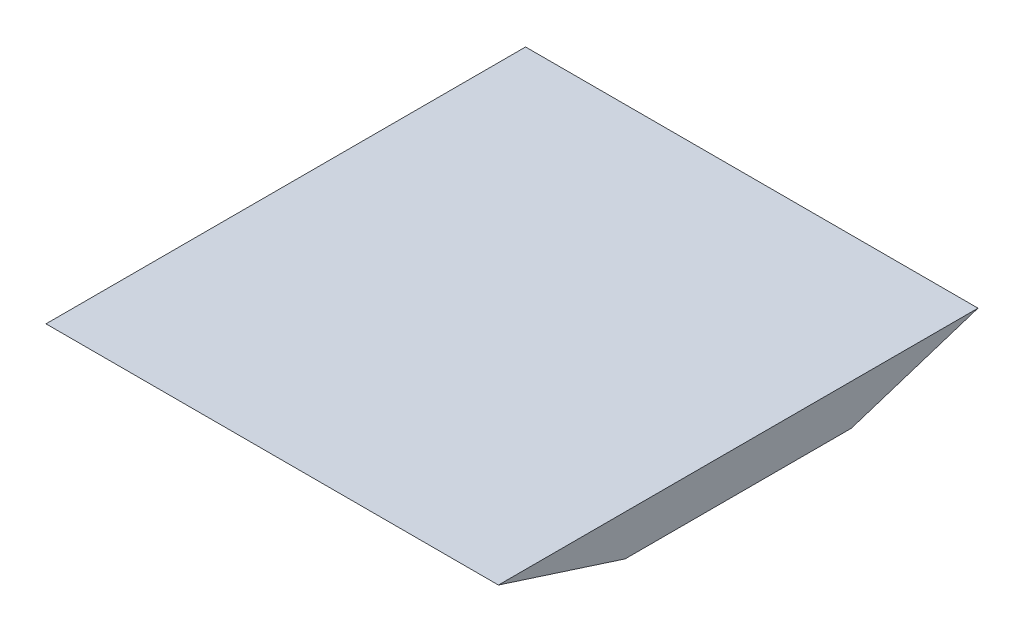
ISO-10303-21;
HEADER;
FILE_DESCRIPTION(('STEP AP214'),'2;1');
FILE_NAME('part.step','',(''),(''),'','','');
FILE_SCHEMA(('AUTOMOTIVE_DESIGN { 1 0 10303 214 1 1 1 1 }'));
ENDSEC;
DATA;
#1=APPLICATION_CONTEXT('core data for automotive mechanical design processes');
#2=APPLICATION_PROTOCOL_DEFINITION('international standard','automotive_design',2000,#1);
#3=PRODUCT_CONTEXT('',#1,'mechanical');
#4=PRODUCT('Part','Part','',(#3));
#5=PRODUCT_RELATED_PRODUCT_CATEGORY('part','',(#4));
#6=PRODUCT_DEFINITION_FORMATION('','',#4);
#7=PRODUCT_DEFINITION_CONTEXT('part definition',#1,'design');
#8=PRODUCT_DEFINITION('design','',#6,#7);
#9=PRODUCT_DEFINITION_SHAPE('','',#8);
#10=(LENGTH_UNIT() NAMED_UNIT(*) SI_UNIT(.MILLI.,.METRE.));
#11=(NAMED_UNIT(*) PLANE_ANGLE_UNIT() SI_UNIT($,.RADIAN.));
#12=(NAMED_UNIT(*) SI_UNIT($,.STERADIAN.) SOLID_ANGLE_UNIT());
#13=UNCERTAINTY_MEASURE_WITH_UNIT(LENGTH_MEASURE(1.E-05),#10,'distance_accuracy_value','');
#14=(GEOMETRIC_REPRESENTATION_CONTEXT(3) GLOBAL_UNCERTAINTY_ASSIGNED_CONTEXT((#13)) GLOBAL_UNIT_ASSIGNED_CONTEXT((#10,
#11,#12)) REPRESENTATION_CONTEXT('',''));
#15=CARTESIAN_POINT('',(0.,0.,0.));
#16=DIRECTION('',(0.,0.,1.));
#17=DIRECTION('',(1.,0.,0.));
#18=AXIS2_PLACEMENT_3D('',#15,#16,#17);
#19=CARTESIAN_POINT('',(100.,-9.,-28.));
#20=DIRECTION('',(0.,0.952028561285264,-0.306009180413121));
#21=DIRECTION('',(0.,0.306009180413121,0.952028561285264));
#22=AXIS2_PLACEMENT_3D('',#19,#20,#21);
#23=PLANE('',#22);
#24=DIRECTION('',(0.,-0.306009180413121,-0.952028561285264));
#25=VECTOR('',#24,1.);
#26=CARTESIAN_POINT('',(0.,-9.,-28.));
#27=LINE('',#26,#25);
#28=CARTESIAN_POINT('',(0.,0.,0.));
#29=VERTEX_POINT('',#28);
#30=CARTESIAN_POINT('',(0.,-9.,-28.));
#31=VERTEX_POINT('',#30);
#32=EDGE_CURVE('E107',#29,#31,#27,.T.);
#33=ORIENTED_EDGE('',*,*,#32,.T.);
#34=DIRECTION('',(-1.,0.,0.));
#35=VECTOR('',#34,1.);
#36=CARTESIAN_POINT('',(100.,-9.,-28.));
#37=LINE('',#36,#35);
#38=CARTESIAN_POINT('',(100.,-9.,-28.));
#39=VERTEX_POINT('',#38);
#40=EDGE_CURVE('E11',#39,#31,#37,.T.);
#41=ORIENTED_EDGE('',*,*,#40,.F.);
#42=DIRECTION('',(0.,-0.306009180413121,-0.952028561285264));
#43=VECTOR('',#42,1.);
#44=CARTESIAN_POINT('',(100.,-9.,-28.));
#45=LINE('',#44,#43);
#46=CARTESIAN_POINT('',(100.,0.,0.));
#47=VERTEX_POINT('',#46);
#48=EDGE_CURVE('E91',#47,#39,#45,.T.);
#49=ORIENTED_EDGE('',*,*,#48,.F.);
#50=DIRECTION('',(-1.,0.,0.));
#51=VECTOR('',#50,1.);
#52=CARTESIAN_POINT('',(100.,0.,0.));
#53=LINE('',#52,#51);
#54=EDGE_CURVE('E103',#47,#29,#53,.T.);
#55=ORIENTED_EDGE('',*,*,#54,.T.);
#56=EDGE_LOOP('',(#33,#41,#49,#55));
#57=FACE_BOUND('',#56,.T.);
#58=ADVANCED_FACE('F39',(#57),#23,.F.);
#59=CARTESIAN_POINT('',(100.,-8.99999999999999,-78.));
#60=DIRECTION('',(0.,1.,0.));
#61=DIRECTION('',(0.,0.,1.));
#62=AXIS2_PLACEMENT_3D('',#59,#60,#61);
#63=PLANE('',#62);
#64=DIRECTION('',(0.,0.,-1.));
#65=VECTOR('',#64,1.);
#66=CARTESIAN_POINT('',(0.,-8.99999999999999,-78.));
#67=LINE('',#66,#65);
#68=CARTESIAN_POINT('',(0.,-8.99999999999999,-78.));
#69=VERTEX_POINT('',#68);
#70=EDGE_CURVE('E96',#31,#69,#67,.T.);
#71=ORIENTED_EDGE('',*,*,#70,.T.);
#72=DIRECTION('',(-1.,0.,0.));
#73=VECTOR('',#72,1.);
#74=CARTESIAN_POINT('',(100.,-8.99999999999999,-78.));
#75=LINE('',#74,#73);
#76=CARTESIAN_POINT('',(100.,-8.99999999999999,-78.));
#77=VERTEX_POINT('',#76);
#78=EDGE_CURVE('E48',#77,#69,#75,.T.);
#79=ORIENTED_EDGE('',*,*,#78,.F.);
#80=DIRECTION('',(0.,0.,-1.));
#81=VECTOR('',#80,1.);
#82=CARTESIAN_POINT('',(100.,-8.99999999999999,-78.));
#83=LINE('',#82,#81);
#84=EDGE_CURVE('E86',#39,#77,#83,.T.);
#85=ORIENTED_EDGE('',*,*,#84,.F.);
#86=ORIENTED_EDGE('',*,*,#40,.T.);
#87=EDGE_LOOP('',(#71,#79,#85,#86));
#88=FACE_BOUND('',#87,.T.);
#89=ADVANCED_FACE('F95',(#88),#63,.F.);
#90=CARTESIAN_POINT('',(100.,0.,-106.));
#91=DIRECTION('',(0.,0.952028561285264,0.306009180413121));
#92=DIRECTION('',(0.,-0.306009180413121,0.952028561285264));
#93=AXIS2_PLACEMENT_3D('',#90,#91,#92);
#94=PLANE('',#93);
#95=DIRECTION('',(0.,0.306009180413121,-0.952028561285264));
#96=VECTOR('',#95,1.);
#97=CARTESIAN_POINT('',(0.,0.,-106.));
#98=LINE('',#97,#96);
#99=CARTESIAN_POINT('',(0.,0.,-106.));
#100=VERTEX_POINT('',#99);
#101=EDGE_CURVE('E73',#69,#100,#98,.T.);
#102=ORIENTED_EDGE('',*,*,#101,.T.);
#103=DIRECTION('',(-1.,0.,0.));
#104=VECTOR('',#103,1.);
#105=CARTESIAN_POINT('',(100.,0.,-106.));
#106=LINE('',#105,#104);
#107=CARTESIAN_POINT('',(100.,0.,-106.));
#108=VERTEX_POINT('',#107);
#109=EDGE_CURVE('E98',#108,#100,#106,.T.);
#110=ORIENTED_EDGE('',*,*,#109,.F.);
#111=DIRECTION('',(0.,0.306009180413121,-0.952028561285264));
#112=VECTOR('',#111,1.);
#113=CARTESIAN_POINT('',(100.,0.,-106.));
#114=LINE('',#113,#112);
#115=EDGE_CURVE('E89',#77,#108,#114,.T.);
#116=ORIENTED_EDGE('',*,*,#115,.F.);
#117=ORIENTED_EDGE('',*,*,#78,.T.);
#118=EDGE_LOOP('',(#102,#110,#116,#117));
#119=FACE_BOUND('',#118,.T.);
#120=ADVANCED_FACE('F99',(#119),#94,.F.);
#121=CARTESIAN_POINT('',(100.,0.,0.));
#122=DIRECTION('',(0.,-1.,0.));
#123=DIRECTION('',(0.,0.,-1.));
#124=AXIS2_PLACEMENT_3D('',#121,#122,#123);
#125=PLANE('',#124);
#126=DIRECTION('',(0.,0.,1.));
#127=VECTOR('',#126,1.);
#128=CARTESIAN_POINT('',(0.,0.,0.));
#129=LINE('',#128,#127);
#130=EDGE_CURVE('E79',#100,#29,#129,.T.);
#131=ORIENTED_EDGE('',*,*,#130,.T.);
#132=ORIENTED_EDGE('',*,*,#54,.F.);
#133=DIRECTION('',(0.,0.,1.));
#134=VECTOR('',#133,1.);
#135=CARTESIAN_POINT('',(100.,0.,0.));
#136=LINE('',#135,#134);
#137=EDGE_CURVE('E56',#108,#47,#136,.T.);
#138=ORIENTED_EDGE('',*,*,#137,.F.);
#139=ORIENTED_EDGE('',*,*,#109,.T.);
#140=EDGE_LOOP('',(#131,#132,#138,#139));
#141=FACE_BOUND('',#140,.T.);
#142=ADVANCED_FACE('F120',(#141),#125,.F.);
#143=CARTESIAN_POINT('',(100.,0.,0.));
#144=DIRECTION('',(1.,0.,0.));
#145=DIRECTION('',(0.,0.,-1.));
#146=AXIS2_PLACEMENT_3D('',#143,#144,#145);
#147=PLANE('',#146);
#148=ORIENTED_EDGE('',*,*,#48,.T.);
#149=ORIENTED_EDGE('',*,*,#84,.T.);
#150=ORIENTED_EDGE('',*,*,#115,.T.);
#151=ORIENTED_EDGE('',*,*,#137,.T.);
#152=EDGE_LOOP('',(#148,#149,#150,#151));
#153=FACE_BOUND('',#152,.T.);
#154=ADVANCED_FACE('F87',(#153),#147,.T.);
#155=CARTESIAN_POINT('',(0.,0.,0.));
#156=DIRECTION('',(1.,0.,0.));
#157=DIRECTION('',(0.,0.,-1.));
#158=AXIS2_PLACEMENT_3D('',#155,#156,#157);
#159=PLANE('',#158);
#160=ORIENTED_EDGE('',*,*,#32,.F.);
#161=ORIENTED_EDGE('',*,*,#130,.F.);
#162=ORIENTED_EDGE('',*,*,#101,.F.);
#163=ORIENTED_EDGE('',*,*,#70,.F.);
#164=EDGE_LOOP('',(#160,#161,#162,#163));
#165=FACE_BOUND('',#164,.T.);
#166=ADVANCED_FACE('F123',(#165),#159,.F.);
#167=CLOSED_SHELL('',(#58,#89,#120,#142,#154,#166));
#168=MANIFOLD_SOLID_BREP('B2',#167);
#169=ADVANCED_BREP_SHAPE_REPRESENTATION('',(#18,#168),#14);
#170=SHAPE_DEFINITION_REPRESENTATION(#9,#169);
ENDSEC;
END-ISO-10303-21;
